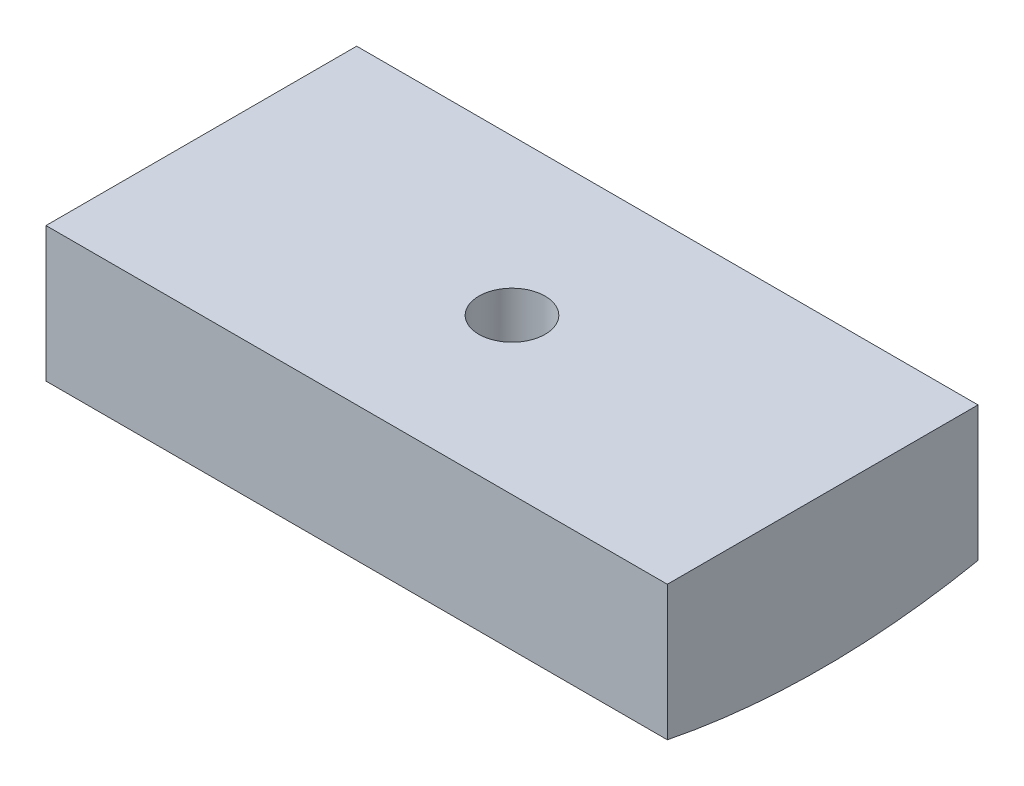
ISO-10303-21;
HEADER;
FILE_DESCRIPTION(('STEP AP214'),'2;1');
FILE_NAME('part.step','',(''),(''),'','','');
FILE_SCHEMA(('AUTOMOTIVE_DESIGN { 1 0 10303 214 1 1 1 1 }'));
ENDSEC;
DATA;
#1=APPLICATION_CONTEXT('core data for automotive mechanical design processes');
#2=APPLICATION_PROTOCOL_DEFINITION('international standard','automotive_design',2000,#1);
#3=PRODUCT_CONTEXT('',#1,'mechanical');
#4=PRODUCT('Part','Part','',(#3));
#5=PRODUCT_RELATED_PRODUCT_CATEGORY('part','',(#4));
#6=PRODUCT_DEFINITION_FORMATION('','',#4);
#7=PRODUCT_DEFINITION_CONTEXT('part definition',#1,'design');
#8=PRODUCT_DEFINITION('design','',#6,#7);
#9=PRODUCT_DEFINITION_SHAPE('','',#8);
#10=(LENGTH_UNIT() NAMED_UNIT(*) SI_UNIT(.MILLI.,.METRE.));
#11=(NAMED_UNIT(*) PLANE_ANGLE_UNIT() SI_UNIT($,.RADIAN.));
#12=(NAMED_UNIT(*) SI_UNIT($,.STERADIAN.) SOLID_ANGLE_UNIT());
#13=UNCERTAINTY_MEASURE_WITH_UNIT(LENGTH_MEASURE(1.E-05),#10,'distance_accuracy_value','');
#14=(GEOMETRIC_REPRESENTATION_CONTEXT(3) GLOBAL_UNCERTAINTY_ASSIGNED_CONTEXT((#13)) GLOBAL_UNIT_ASSIGNED_CONTEXT((#10,
#11,#12)) REPRESENTATION_CONTEXT('',''));
#15=CARTESIAN_POINT('',(0.,0.,0.));
#16=DIRECTION('',(0.,0.,1.));
#17=DIRECTION('',(1.,0.,0.));
#18=AXIS2_PLACEMENT_3D('',#15,#16,#17);
#19=CARTESIAN_POINT('',(60.,-61.79,15.));
#20=DIRECTION('',(0.,0.,-1.));
#21=DIRECTION('',(-1.,0.,0.));
#22=AXIS2_PLACEMENT_3D('',#19,#20,#21);
#23=PLANE('',#22);
#24=DIRECTION('',(0.,-1.,0.));
#25=VECTOR('',#24,1.);
#26=CARTESIAN_POINT('',(0.,-61.79,15.));
#27=LINE('',#26,#25);
#28=CARTESIAN_POINT('',(0.,-61.79,15.));
#29=VERTEX_POINT('',#28);
#30=CARTESIAN_POINT('',(0.,-74.8008295408547,15.));
#31=VERTEX_POINT('',#30);
#32=EDGE_CURVE('E101',#29,#31,#27,.T.);
#33=ORIENTED_EDGE('',*,*,#32,.T.);
#34=DIRECTION('',(-1.,0.,0.));
#35=VECTOR('',#34,1.);
#36=CARTESIAN_POINT('',(60.,-74.8008295408547,15.));
#37=LINE('',#36,#35);
#38=CARTESIAN_POINT('',(60.,-74.8008295408547,15.));
#39=VERTEX_POINT('',#38);
#40=EDGE_CURVE('E11',#39,#31,#37,.T.);
#41=ORIENTED_EDGE('',*,*,#40,.F.);
#42=DIRECTION('',(0.,-1.,0.));
#43=VECTOR('',#42,1.);
#44=CARTESIAN_POINT('',(60.,-61.79,15.));
#45=LINE('',#44,#43);
#46=CARTESIAN_POINT('',(60.,-61.79,15.));
#47=VERTEX_POINT('',#46);
#48=EDGE_CURVE('E89',#47,#39,#45,.T.);
#49=ORIENTED_EDGE('',*,*,#48,.F.);
#50=DIRECTION('',(-1.,0.,0.));
#51=VECTOR('',#50,1.);
#52=CARTESIAN_POINT('',(60.,-61.79,15.));
#53=LINE('',#52,#51);
#54=EDGE_CURVE('E97',#47,#29,#53,.T.);
#55=ORIENTED_EDGE('',*,*,#54,.T.);
#56=EDGE_LOOP('',(#33,#41,#49,#55));
#57=FACE_BOUND('',#56,.T.);
#58=ADVANCED_FACE('F38',(#57),#23,.F.);
#59=CARTESIAN_POINT('',(60.,0.,0.));
#60=DIRECTION('',(-1.,0.,0.));
#61=DIRECTION('',(0.,0.,1.));
#62=AXIS2_PLACEMENT_3D('',#59,#60,#61);
#63=CYLINDRICAL_SURFACE('',#62,76.29);
#64=CARTESIAN_POINT('',(26.8,-76.29,0.));
#65=CARTESIAN_POINT('',(26.8000079408052,-76.2899990991748,0.179660635141424));
#66=CARTESIAN_POINT('',(26.8151810889765,-76.2893585547577,0.359449528392011));
#67=CARTESIAN_POINT('',(26.8754959757105,-76.2868648746974,0.714070022196609));
#68=CARTESIAN_POINT('',(26.9206732500165,-76.285010301242,0.888895487932322));
#69=CARTESIAN_POINT('',(27.039702822202,-76.2802985247484,1.22840062582905));
#70=CARTESIAN_POINT('',(27.1135407773185,-76.2774418232774,1.39308532508241));
#71=CARTESIAN_POINT('',(27.2877743519136,-76.2710477538615,1.70767711616468));
#72=CARTESIAN_POINT('',(27.3881636032903,-76.267510549185,1.8575877396114));
#73=CARTESIAN_POINT('',(27.6127356042391,-76.2601505775007,2.13853429032672));
#74=CARTESIAN_POINT('',(27.7369338553582,-76.2563276254435,2.26955782269306));
#75=CARTESIAN_POINT('',(28.0055684497485,-76.2488286371062,2.50890567283339));
#76=CARTESIAN_POINT('',(28.1500056096533,-76.245152606762,2.61722907422407));
#77=CARTESIAN_POINT('',(28.455077712218,-76.2383607947648,2.80813181259762));
#78=CARTESIAN_POINT('',(28.6157183243266,-76.2352452102756,2.8907020971464));
#79=CARTESIAN_POINT('',(28.9485972892926,-76.229927725931,3.02769646749459));
#80=CARTESIAN_POINT('',(29.1208355733736,-76.2277258206578,3.08212072018898));
#81=CARTESIAN_POINT('',(29.4719122898639,-76.2244855721111,3.16124707572321));
#82=CARTESIAN_POINT('',(29.6507467413683,-76.2234465385193,3.18596681276953));
#83=CARTESIAN_POINT('',(30.0100297314195,-76.2226471229918,3.20503681722389));
#84=CARTESIAN_POINT('',(30.1904782601371,-76.2228867332749,3.19938726944596));
#85=CARTESIAN_POINT('',(30.5477474053721,-76.2246169430161,3.15789382228715));
#86=CARTESIAN_POINT('',(30.724570238283,-76.2261067533621,3.12206896916315));
#87=CARTESIAN_POINT('',(31.0696899975655,-76.2301681907656,3.02127134422126));
#88=CARTESIAN_POINT('',(31.2379868958796,-76.2327398213828,2.9562984764888));
#89=CARTESIAN_POINT('',(31.5613388437829,-76.2386759409635,2.79902735326509));
#90=CARTESIAN_POINT('',(31.7163896543117,-76.2420406824558,2.70672039211441));
#91=CARTESIAN_POINT('',(32.0088017000073,-76.2491834934216,2.49740771677282));
#92=CARTESIAN_POINT('',(32.1461628493816,-76.2529615648995,2.38040188280276));
#93=CARTESIAN_POINT('',(32.3994072813248,-76.2605086852507,2.1249052327804));
#94=CARTESIAN_POINT('',(32.5152739171518,-76.2642777249178,1.98639791580695));
#95=CARTESIAN_POINT('',(32.7221120733518,-76.2713791295681,1.69188809624776));
#96=CARTESIAN_POINT('',(32.8130835886786,-76.2747114944628,1.5358855901158));
#97=CARTESIAN_POINT('',(32.9675474465937,-76.2805640457975,1.21080420562936));
#98=CARTESIAN_POINT('',(33.0310392346409,-76.2830842158471,1.04172506346936));
#99=CARTESIAN_POINT('',(33.1287305769508,-76.2870280739973,0.69529418461276));
#100=CARTESIAN_POINT('',(33.1629302858835,-76.2884517678875,0.517942491602636));
#101=CARTESIAN_POINT('',(33.2010462037299,-76.2900414635386,0.16014545124309));
#102=CARTESIAN_POINT('',(33.2049854425883,-76.290208421745,-0.02029743868146));
#103=CARTESIAN_POINT('',(33.1825286611506,-76.2892683647011,-0.379281808198806));
#104=CARTESIAN_POINT('',(33.1561327109768,-76.2881613523955,-0.557823292185899));
#105=CARTESIAN_POINT('',(33.0737738955678,-76.2847986907049,-0.907872337063187));
#106=CARTESIAN_POINT('',(33.0178215188037,-76.2825434487939,-1.07938236990152));
#107=CARTESIAN_POINT('',(32.8779487652494,-76.2771383391867,-1.41057601482689));
#108=CARTESIAN_POINT('',(32.7940282757529,-76.2739884678854,-1.57025957925234));
#109=CARTESIAN_POINT('',(32.6005423643362,-76.2671462874003,-1.87337333104691));
#110=CARTESIAN_POINT('',(32.4909614754561,-76.2634536515637,-2.01679363794711));
#111=CARTESIAN_POINT('',(32.2492880122133,-76.2559430336686,-2.28321040794082));
#112=CARTESIAN_POINT('',(32.1171953337792,-76.2521250510307,-2.40620677660992));
#113=CARTESIAN_POINT('',(31.8341490127273,-76.2447913839735,-2.62836151347323));
#114=CARTESIAN_POINT('',(31.6831836853231,-76.2412758891327,-2.72750500123676));
#115=CARTESIAN_POINT('',(31.3667366742573,-76.2349465661648,-2.89903796938193));
#116=CARTESIAN_POINT('',(31.2012550397332,-76.2321327356627,-2.97142754032072));
#117=CARTESIAN_POINT('',(30.8605283719669,-76.2275253736794,-3.08737177694365));
#118=CARTESIAN_POINT('',(30.6852865935151,-76.2257315042743,-3.13093599355565));
#119=CARTESIAN_POINT('',(30.3299683478317,-76.2233653859578,-3.18802415856381));
#120=CARTESIAN_POINT('',(30.1498918972926,-76.2227931328292,-3.20154821066534));
#121=CARTESIAN_POINT('',(29.7901643482861,-76.2229348927095,-3.19817106170515));
#122=CARTESIAN_POINT('',(29.6105130290359,-76.2236479153825,-3.1812932859901));
#123=CARTESIAN_POINT('',(29.2565966061983,-76.2262777671894,-3.1176399111014));
#124=CARTESIAN_POINT('',(29.0823315130894,-76.228194598665,-3.07086425376719));
#125=CARTESIAN_POINT('',(28.7441282327323,-76.233015803312,-2.94874725890382));
#126=CARTESIAN_POINT('',(28.5801901758281,-76.235920188945,-2.87340556090898));
#127=CARTESIAN_POINT('',(28.2672904897894,-76.242389016693,-2.69630016259176));
#128=CARTESIAN_POINT('',(28.1183283634589,-76.245953436884,-2.59453733984437));
#129=CARTESIAN_POINT('',(27.8394942164012,-76.253343604896,-2.36739793990833));
#130=CARTESIAN_POINT('',(27.7096349123128,-76.2571695243362,-2.24200575832509));
#131=CARTESIAN_POINT('',(27.472772018093,-76.264650563696,-1.97116371550484));
#132=CARTESIAN_POINT('',(27.3657740753598,-76.268305641239,-1.82570891280567));
#133=CARTESIAN_POINT('',(27.1776360088672,-76.2750349982489,-1.51878305694226));
#134=CARTESIAN_POINT('',(27.096516996739,-76.278108802694,-1.35729906749213));
#135=CARTESIAN_POINT('',(26.9626382833681,-76.2833215659882,-1.02311353183306));
#136=CARTESIAN_POINT('',(26.9098449367036,-76.2854616333694,-0.850425568431329));
#137=CARTESIAN_POINT('',(26.8480302395439,-76.287996992257,-0.563880248468178));
#138=CARTESIAN_POINT('',(26.8300417406094,-76.2887448385755,-0.451880755623408));
#139=CARTESIAN_POINT('',(26.8060241198772,-76.2897466264164,-0.226604519041215));
#140=CARTESIAN_POINT('',(26.7999949910352,-76.2900005682298,-0.113327776056152));
#141=CARTESIAN_POINT('',(26.8,-76.29,0.));
#142=B_SPLINE_CURVE_WITH_KNOTS('',3,(#64,#65,#66,#67,#68,#69,#70,#71,#72,#73,#74,#75,#76,#77,
#78,#79,#80,#81,#82,#83,#84,#85,#86,#87,#88,#89,#90,#91,#92,#93,#94,#95,#96,#97,#98,#99,#100,
#101,#102,#103,#104,#105,#106,#107,#108,#109,#110,#111,#112,#113,#114,#115,#116,#117,#118,#119,
#120,#121,#122,#123,#124,#125,#126,#127,#128,#129,#130,#131,#132,#133,#134,#135,#136,#137,#138,
#139,#140,#141),.UNSPECIFIED.,.T.,.F.,(4,2,2,2,2,2,2,2,2,2,2,2,2,2,2,2,2,2,2,2,2,2,2,2,2,2,2,2,
2,2,2,2,2,2,2,2,2,2,4),(0.,0.538568229624021,1.07777545913879,1.61671319849756,2.15552179527307,
2.69468239800103,3.23386476195347,3.77323643993232,4.312604919611,4.85165304255989,
5.39069788510392,5.92940274435441,6.46810937628206,7.00698776623101,7.54586876957365,
8.0851653906291,8.62446212099838,9.16376973387485,9.70307449904696,10.2419687818105,
10.7808618188773,11.3195637512863,11.8582678545874,12.3972975046443,12.9363296466856,
13.4756971927439,14.0150629131242,14.5542498316729,15.0934348888253,15.6322046684971,
16.1709754962447,16.7097531227943,17.2485128561882,17.7876296314132,18.3268794300432,
18.8665680220315,19.4056141409768,19.745336727509,20.0850591139391),.UNSPECIFIED.);
#143=CARTESIAN_POINT('',(26.8,-76.29,0.));
#144=VERTEX_POINT('',#143);
#145=EDGE_CURVE('E104',#144,#144,#142,.T.);
#146=ORIENTED_EDGE('',*,*,#145,.T.);
#147=EDGE_LOOP('',(#146));
#148=FACE_BOUND('',#147,.T.);
#149=CARTESIAN_POINT('',(0.,0.,0.));
#150=DIRECTION('',(1.,0.,0.));
#151=DIRECTION('',(0.,0.,-1.));
#152=AXIS2_PLACEMENT_3D('',#149,#150,#151);
#153=CIRCLE('',#152,76.29);
#154=CARTESIAN_POINT('',(0.,-74.8008295408547,-15.));
#155=VERTEX_POINT('',#154);
#156=EDGE_CURVE('E93',#31,#155,#153,.T.);
#157=ORIENTED_EDGE('',*,*,#156,.T.);
#158=DIRECTION('',(-1.,0.,0.));
#159=VECTOR('',#158,1.);
#160=CARTESIAN_POINT('',(60.,-74.8008295408547,-15.));
#161=LINE('',#160,#159);
#162=CARTESIAN_POINT('',(60.,-74.8008295408547,-15.));
#163=VERTEX_POINT('',#162);
#164=EDGE_CURVE('E46',#163,#155,#161,.T.);
#165=ORIENTED_EDGE('',*,*,#164,.F.);
#166=CARTESIAN_POINT('',(60.,0.,0.));
#167=DIRECTION('',(1.,0.,0.));
#168=DIRECTION('',(0.,0.,-1.));
#169=AXIS2_PLACEMENT_3D('',#166,#167,#168);
#170=CIRCLE('',#169,76.29);
#171=EDGE_CURVE('E84',#39,#163,#170,.T.);
#172=ORIENTED_EDGE('',*,*,#171,.F.);
#173=ORIENTED_EDGE('',*,*,#40,.T.);
#174=EDGE_LOOP('',(#157,#165,#172,#173));
#175=FACE_BOUND('',#174,.T.);
#176=ADVANCED_FACE('F92',(#148,#175),#63,.T.);
#177=CARTESIAN_POINT('',(60.,-61.79,-15.));
#178=DIRECTION('',(0.,0.,1.));
#179=DIRECTION('',(0.,-1.,0.));
#180=AXIS2_PLACEMENT_3D('',#177,#178,#179);
#181=PLANE('',#180);
#182=DIRECTION('',(0.,1.,0.));
#183=VECTOR('',#182,1.);
#184=CARTESIAN_POINT('',(0.,-61.79,-15.));
#185=LINE('',#184,#183);
#186=CARTESIAN_POINT('',(0.,-61.79,-15.));
#187=VERTEX_POINT('',#186);
#188=EDGE_CURVE('E71',#155,#187,#185,.T.);
#189=ORIENTED_EDGE('',*,*,#188,.T.);
#190=DIRECTION('',(-1.,0.,0.));
#191=VECTOR('',#190,1.);
#192=CARTESIAN_POINT('',(60.,-61.79,-15.));
#193=LINE('',#192,#191);
#194=CARTESIAN_POINT('',(60.,-61.79,-15.));
#195=VERTEX_POINT('',#194);
#196=EDGE_CURVE('E94',#195,#187,#193,.T.);
#197=ORIENTED_EDGE('',*,*,#196,.F.);
#198=DIRECTION('',(0.,1.,0.));
#199=VECTOR('',#198,1.);
#200=CARTESIAN_POINT('',(60.,-61.79,-15.));
#201=LINE('',#200,#199);
#202=EDGE_CURVE('E87',#163,#195,#201,.T.);
#203=ORIENTED_EDGE('',*,*,#202,.F.);
#204=ORIENTED_EDGE('',*,*,#164,.T.);
#205=EDGE_LOOP('',(#189,#197,#203,#204));
#206=FACE_BOUND('',#205,.T.);
#207=ADVANCED_FACE('F95',(#206),#181,.F.);
#208=CARTESIAN_POINT('',(60.,-61.79,15.));
#209=DIRECTION('',(0.,-1.,0.));
#210=DIRECTION('',(0.,0.,-1.));
#211=AXIS2_PLACEMENT_3D('',#208,#209,#210);
#212=PLANE('',#211);
#213=CARTESIAN_POINT('',(30.,-61.79,0.));
#214=DIRECTION('',(0.,1.,0.));
#215=DIRECTION('',(0.,0.,1.));
#216=AXIS2_PLACEMENT_3D('',#213,#214,#215);
#217=CIRCLE('',#216,3.2);
#218=CARTESIAN_POINT('',(30.,-61.79,3.2));
#219=VERTEX_POINT('',#218);
#220=EDGE_CURVE('E120',#219,#219,#217,.T.);
#221=ORIENTED_EDGE('',*,*,#220,.F.);
#222=EDGE_LOOP('',(#221));
#223=FACE_BOUND('',#222,.T.);
#224=DIRECTION('',(0.,0.,1.));
#225=VECTOR('',#224,1.);
#226=CARTESIAN_POINT('',(0.,-61.79,15.));
#227=LINE('',#226,#225);
#228=EDGE_CURVE('E77',#187,#29,#227,.T.);
#229=ORIENTED_EDGE('',*,*,#228,.T.);
#230=ORIENTED_EDGE('',*,*,#54,.F.);
#231=DIRECTION('',(0.,0.,1.));
#232=VECTOR('',#231,1.);
#233=CARTESIAN_POINT('',(60.,-61.79,15.));
#234=LINE('',#233,#232);
#235=EDGE_CURVE('E54',#195,#47,#234,.T.);
#236=ORIENTED_EDGE('',*,*,#235,.F.);
#237=ORIENTED_EDGE('',*,*,#196,.T.);
#238=EDGE_LOOP('',(#229,#230,#236,#237));
#239=FACE_BOUND('',#238,.T.);
#240=ADVANCED_FACE('F109',(#223,#239),#212,.F.);
#241=CARTESIAN_POINT('',(60.,0.,0.));
#242=DIRECTION('',(1.,0.,0.));
#243=DIRECTION('',(0.,0.,-1.));
#244=AXIS2_PLACEMENT_3D('',#241,#242,#243);
#245=PLANE('',#244);
#246=ORIENTED_EDGE('',*,*,#48,.T.);
#247=ORIENTED_EDGE('',*,*,#171,.T.);
#248=ORIENTED_EDGE('',*,*,#202,.T.);
#249=ORIENTED_EDGE('',*,*,#235,.T.);
#250=EDGE_LOOP('',(#246,#247,#248,#249));
#251=FACE_BOUND('',#250,.T.);
#252=ADVANCED_FACE('F85',(#251),#245,.T.);
#253=CARTESIAN_POINT('',(0.,0.,0.));
#254=DIRECTION('',(1.,0.,0.));
#255=DIRECTION('',(0.,0.,-1.));
#256=AXIS2_PLACEMENT_3D('',#253,#254,#255);
#257=PLANE('',#256);
#258=ORIENTED_EDGE('',*,*,#32,.F.);
#259=ORIENTED_EDGE('',*,*,#228,.F.);
#260=ORIENTED_EDGE('',*,*,#188,.F.);
#261=ORIENTED_EDGE('',*,*,#156,.F.);
#262=EDGE_LOOP('',(#258,#259,#260,#261));
#263=FACE_BOUND('',#262,.T.);
#264=ADVANCED_FACE('F112',(#263),#257,.F.);
#265=CARTESIAN_POINT('',(30.,-76.29,0.));
#266=DIRECTION('',(0.,1.,0.));
#267=DIRECTION('',(0.,0.,1.));
#268=AXIS2_PLACEMENT_3D('',#265,#266,#267);
#269=CYLINDRICAL_SURFACE('',#268,3.2);
#270=ORIENTED_EDGE('',*,*,#220,.T.);
#271=EDGE_LOOP('',(#270));
#272=FACE_BOUND('',#271,.T.);
#273=ORIENTED_EDGE('',*,*,#145,.F.);
#274=EDGE_LOOP('',(#273));
#275=FACE_BOUND('',#274,.T.);
#276=ADVANCED_FACE('F123',(#272,#275),#269,.F.);
#277=CLOSED_SHELL('',(#58,#176,#207,#240,#252,#264,#276));
#278=MANIFOLD_SOLID_BREP('B2',#277);
#279=ADVANCED_BREP_SHAPE_REPRESENTATION('',(#18,#278),#14);
#280=SHAPE_DEFINITION_REPRESENTATION(#9,#279);
ENDSEC;
END-ISO-10303-21;
